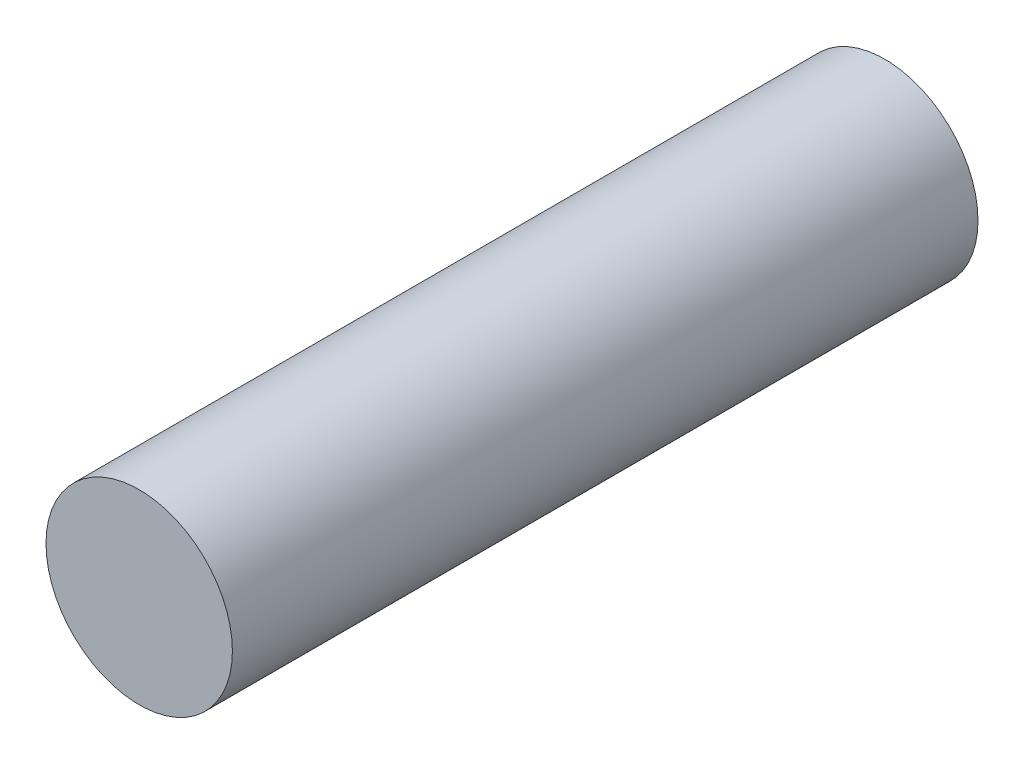
ISO-10303-21;
HEADER;
FILE_DESCRIPTION(('STEP AP214'),'2;1');
FILE_NAME('part.step','',(''),(''),'','','');
FILE_SCHEMA(('AUTOMOTIVE_DESIGN { 1 0 10303 214 1 1 1 1 }'));
ENDSEC;
DATA;
#1=APPLICATION_CONTEXT('core data for automotive mechanical design processes');
#2=APPLICATION_PROTOCOL_DEFINITION('international standard','automotive_design',2000,#1);
#3=PRODUCT_CONTEXT('',#1,'mechanical');
#4=PRODUCT('Part','Part','',(#3));
#5=PRODUCT_RELATED_PRODUCT_CATEGORY('part','',(#4));
#6=PRODUCT_DEFINITION_FORMATION('','',#4);
#7=PRODUCT_DEFINITION_CONTEXT('part definition',#1,'design');
#8=PRODUCT_DEFINITION('design','',#6,#7);
#9=PRODUCT_DEFINITION_SHAPE('','',#8);
#10=(LENGTH_UNIT() NAMED_UNIT(*) SI_UNIT(.MILLI.,.METRE.));
#11=(NAMED_UNIT(*) PLANE_ANGLE_UNIT() SI_UNIT($,.RADIAN.));
#12=(NAMED_UNIT(*) SI_UNIT($,.STERADIAN.) SOLID_ANGLE_UNIT());
#13=UNCERTAINTY_MEASURE_WITH_UNIT(LENGTH_MEASURE(1.E-05),#10,'distance_accuracy_value','');
#14=(GEOMETRIC_REPRESENTATION_CONTEXT(3) GLOBAL_UNCERTAINTY_ASSIGNED_CONTEXT((#13)) GLOBAL_UNIT_ASSIGNED_CONTEXT((#10,
#11,#12)) REPRESENTATION_CONTEXT('',''));
#15=CARTESIAN_POINT('',(0.,0.,0.));
#16=DIRECTION('',(0.,0.,1.));
#17=DIRECTION('',(1.,0.,0.));
#18=AXIS2_PLACEMENT_3D('',#15,#16,#17);
#19=CARTESIAN_POINT('',(0.,0.,14.));
#20=DIRECTION('',(0.,0.,-1.));
#21=DIRECTION('',(-1.,0.,0.));
#22=AXIS2_PLACEMENT_3D('',#19,#20,#21);
#23=CYLINDRICAL_SURFACE('',#22,1.75);
#24=CARTESIAN_POINT('',(0.,0.,14.));
#25=DIRECTION('',(0.,0.,1.));
#26=DIRECTION('',(1.,0.,0.));
#27=AXIS2_PLACEMENT_3D('',#24,#25,#26);
#28=CIRCLE('',#27,1.75);
#29=CARTESIAN_POINT('',(1.75,0.,14.));
#30=VERTEX_POINT('',#29);
#31=EDGE_CURVE('E10',#30,#30,#28,.T.);
#32=ORIENTED_EDGE('',*,*,#31,.F.);
#33=EDGE_LOOP('',(#32));
#34=FACE_BOUND('',#33,.T.);
#35=CARTESIAN_POINT('',(0.,0.,0.));
#36=DIRECTION('',(0.,0.,1.));
#37=DIRECTION('',(1.,0.,0.));
#38=AXIS2_PLACEMENT_3D('',#35,#36,#37);
#39=CIRCLE('',#38,1.75);
#40=CARTESIAN_POINT('',(1.75,0.,0.));
#41=VERTEX_POINT('',#40);
#42=EDGE_CURVE('E39',#41,#41,#39,.T.);
#43=ORIENTED_EDGE('',*,*,#42,.T.);
#44=EDGE_LOOP('',(#43));
#45=FACE_BOUND('',#44,.T.);
#46=ADVANCED_FACE('F36',(#34,#45),#23,.T.);
#47=CARTESIAN_POINT('',(0.,0.,14.));
#48=DIRECTION('',(0.,0.,1.));
#49=DIRECTION('',(1.,0.,0.));
#50=AXIS2_PLACEMENT_3D('',#47,#48,#49);
#51=PLANE('',#50);
#52=ORIENTED_EDGE('',*,*,#31,.T.);
#53=EDGE_LOOP('',(#52));
#54=FACE_BOUND('',#53,.T.);
#55=ADVANCED_FACE('F51',(#54),#51,.T.);
#56=CARTESIAN_POINT('',(0.,0.,0.));
#57=DIRECTION('',(0.,0.,1.));
#58=DIRECTION('',(1.,0.,0.));
#59=AXIS2_PLACEMENT_3D('',#56,#57,#58);
#60=PLANE('',#59);
#61=ORIENTED_EDGE('',*,*,#42,.F.);
#62=EDGE_LOOP('',(#61));
#63=FACE_BOUND('',#62,.T.);
#64=ADVANCED_FACE('F49',(#63),#60,.F.);
#65=CLOSED_SHELL('',(#46,#55,#64));
#66=MANIFOLD_SOLID_BREP('B2',#65);
#67=ADVANCED_BREP_SHAPE_REPRESENTATION('',(#18,#66),#14);
#68=SHAPE_DEFINITION_REPRESENTATION(#9,#67);
ENDSEC;
END-ISO-10303-21;
